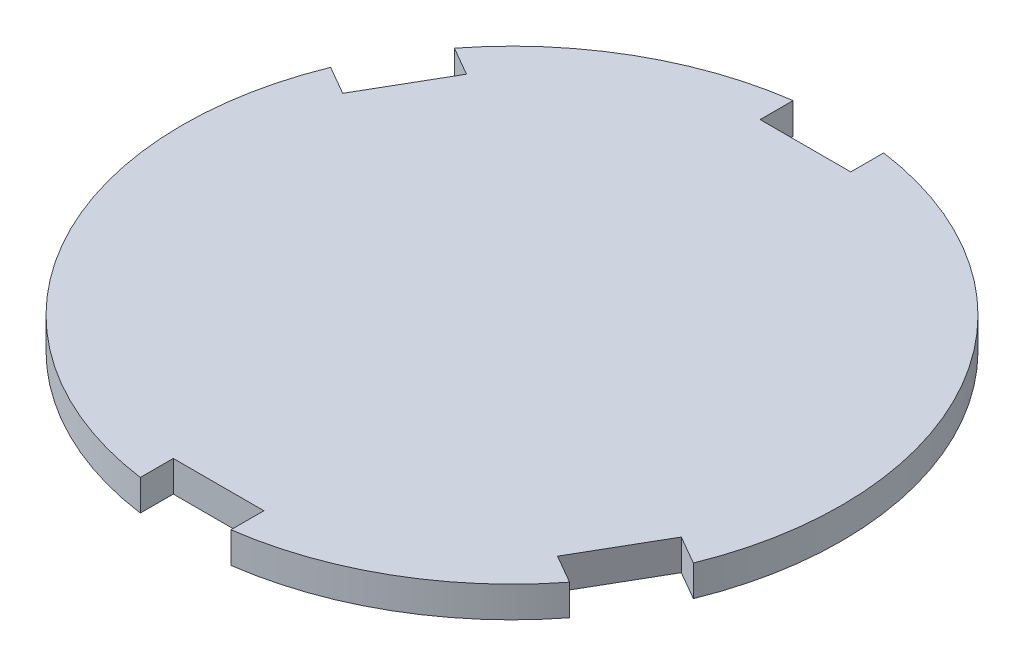
ISO-10303-21;
HEADER;
FILE_DESCRIPTION(('STEP AP214'),'2;1');
FILE_NAME('part.step','',(''),(''),'','','');
FILE_SCHEMA(('AUTOMOTIVE_DESIGN { 1 0 10303 214 1 1 1 1 }'));
ENDSEC;
DATA;
#1=APPLICATION_CONTEXT('core data for automotive mechanical design processes');
#2=APPLICATION_PROTOCOL_DEFINITION('international standard','automotive_design',2000,#1);
#3=PRODUCT_CONTEXT('',#1,'mechanical');
#4=PRODUCT('Part','Part','',(#3));
#5=PRODUCT_RELATED_PRODUCT_CATEGORY('part','',(#4));
#6=PRODUCT_DEFINITION_FORMATION('','',#4);
#7=PRODUCT_DEFINITION_CONTEXT('part definition',#1,'design');
#8=PRODUCT_DEFINITION('design','',#6,#7);
#9=PRODUCT_DEFINITION_SHAPE('','',#8);
#10=(LENGTH_UNIT() NAMED_UNIT(*) SI_UNIT(.MILLI.,.METRE.));
#11=(NAMED_UNIT(*) PLANE_ANGLE_UNIT() SI_UNIT($,.RADIAN.));
#12=(NAMED_UNIT(*) SI_UNIT($,.STERADIAN.) SOLID_ANGLE_UNIT());
#13=UNCERTAINTY_MEASURE_WITH_UNIT(LENGTH_MEASURE(1.E-05),#10,'distance_accuracy_value','');
#14=(GEOMETRIC_REPRESENTATION_CONTEXT(3) GLOBAL_UNCERTAINTY_ASSIGNED_CONTEXT((#13)) GLOBAL_UNIT_ASSIGNED_CONTEXT((#10,
#11,#12)) REPRESENTATION_CONTEXT('',''));
#15=CARTESIAN_POINT('',(0.,0.,0.));
#16=DIRECTION('',(0.,0.,1.));
#17=DIRECTION('',(1.,0.,0.));
#18=AXIS2_PLACEMENT_3D('',#15,#16,#17);
#19=CARTESIAN_POINT('',(0.,4.7625,0.));
#20=DIRECTION('',(0.,-1.,0.));
#21=DIRECTION('',(0.,0.,-1.));
#22=AXIS2_PLACEMENT_3D('',#19,#20,#21);
#23=CYLINDRICAL_SURFACE('',#22,50.8);
#24=CARTESIAN_POINT('',(0.,4.7625,0.));
#25=DIRECTION('',(0.,1.,0.));
#26=DIRECTION('',(0.,0.,1.));
#27=AXIS2_PLACEMENT_3D('',#24,#25,#26);
#28=CIRCLE('',#27,50.8);
#29=CARTESIAN_POINT('',(-47.0687243803888,4.7625,-19.109557430851));
#30=VERTEX_POINT('',#29);
#31=CARTESIAN_POINT('',(-6.98499999999999,4.7625,50.3174897525701));
#32=VERTEX_POINT('',#31);
#33=EDGE_CURVE('E43',#30,#32,#28,.T.);
#34=ORIENTED_EDGE('',*,*,#33,.F.);
#35=DIRECTION('',(0.,1.,0.));
#36=VECTOR('',#35,1.);
#37=CARTESIAN_POINT('',(-47.0687243803888,-0.00100000000000013,-19.109557430851));
#38=LINE('',#37,#36);
#39=CARTESIAN_POINT('',(-47.0687243803888,0.,-19.109557430851));
#40=VERTEX_POINT('',#39);
#41=EDGE_CURVE('E254',#40,#30,#38,.T.);
#42=ORIENTED_EDGE('',*,*,#41,.F.);
#43=CARTESIAN_POINT('',(0.,0.,0.));
#44=DIRECTION('',(0.,1.,0.));
#45=DIRECTION('',(0.,0.,1.));
#46=AXIS2_PLACEMENT_3D('',#43,#44,#45);
#47=CIRCLE('',#46,50.8);
#48=CARTESIAN_POINT('',(-6.98499999999999,0.,50.3174897525701));
#49=VERTEX_POINT('',#48);
#50=EDGE_CURVE('E173',#40,#49,#47,.T.);
#51=ORIENTED_EDGE('',*,*,#50,.T.);
#52=DIRECTION('',(0.,1.,0.));
#53=VECTOR('',#52,1.);
#54=CARTESIAN_POINT('',(-6.98499999999999,-0.00100000000000013,50.3174897525701));
#55=LINE('',#54,#53);
#56=EDGE_CURVE('E196',#49,#32,#55,.T.);
#57=ORIENTED_EDGE('',*,*,#56,.T.);
#58=EDGE_LOOP('',(#34,#42,#51,#57));
#59=FACE_BOUND('',#58,.T.);
#60=ADVANCED_FACE('F33',(#59),#23,.T.);
#61=CARTESIAN_POINT('',(6.98500000000001,0.,50.3174897525701));
#62=VERTEX_POINT('',#61);
#63=CARTESIAN_POINT('',(40.0837243803888,0.,31.2079323217196));
#64=VERTEX_POINT('',#63);
#65=EDGE_CURVE('E37',#62,#64,#47,.T.);
#66=ORIENTED_EDGE('',*,*,#65,.T.);
#67=DIRECTION('',(0.,1.,0.));
#68=VECTOR('',#67,1.);
#69=CARTESIAN_POINT('',(40.0837243803887,-0.00100000000000013,31.2079323217196));
#70=LINE('',#69,#68);
#71=CARTESIAN_POINT('',(40.0837243803887,4.7625,31.2079323217196));
#72=VERTEX_POINT('',#71);
#73=EDGE_CURVE('E150',#64,#72,#70,.T.);
#74=ORIENTED_EDGE('',*,*,#73,.T.);
#75=CARTESIAN_POINT('',(6.98500000000001,4.7625,50.3174897525701));
#76=VERTEX_POINT('',#75);
#77=EDGE_CURVE('E11',#76,#72,#28,.T.);
#78=ORIENTED_EDGE('',*,*,#77,.F.);
#79=DIRECTION('',(0.,1.,0.));
#80=VECTOR('',#79,1.);
#81=CARTESIAN_POINT('',(6.98500000000001,-0.00100000000000013,50.3174897525701));
#82=LINE('',#81,#80);
#83=EDGE_CURVE('E170',#62,#76,#82,.T.);
#84=ORIENTED_EDGE('',*,*,#83,.F.);
#85=EDGE_LOOP('',(#66,#74,#78,#84));
#86=FACE_BOUND('',#85,.T.);
#87=ADVANCED_FACE('F169',(#86),#23,.T.);
#88=CARTESIAN_POINT('',(-6.98499999999999,0.,-50.3174897525701));
#89=VERTEX_POINT('',#88);
#90=CARTESIAN_POINT('',(-40.0837243803887,0.,-31.2079323217196));
#91=VERTEX_POINT('',#90);
#92=EDGE_CURVE('E172',#89,#91,#47,.T.);
#93=ORIENTED_EDGE('',*,*,#92,.T.);
#94=DIRECTION('',(0.,1.,0.));
#95=VECTOR('',#94,1.);
#96=CARTESIAN_POINT('',(-40.0837243803887,-0.00100000000000013,-31.2079323217196));
#97=LINE('',#96,#95);
#98=CARTESIAN_POINT('',(-40.0837243803887,4.7625,-31.2079323217196));
#99=VERTEX_POINT('',#98);
#100=EDGE_CURVE('E59',#91,#99,#97,.T.);
#101=ORIENTED_EDGE('',*,*,#100,.T.);
#102=CARTESIAN_POINT('',(-6.98499999999999,4.7625,-50.3174897525701));
#103=VERTEX_POINT('',#102);
#104=EDGE_CURVE('E44',#103,#99,#28,.T.);
#105=ORIENTED_EDGE('',*,*,#104,.F.);
#106=DIRECTION('',(0.,1.,0.));
#107=VECTOR('',#106,1.);
#108=CARTESIAN_POINT('',(-6.98499999999999,-0.00100000000000013,-50.3174897525701));
#109=LINE('',#108,#107);
#110=EDGE_CURVE('E217',#89,#103,#109,.T.);
#111=ORIENTED_EDGE('',*,*,#110,.F.);
#112=EDGE_LOOP('',(#93,#101,#105,#111));
#113=FACE_BOUND('',#112,.T.);
#114=ADVANCED_FACE('F280',(#113),#23,.T.);
#115=CARTESIAN_POINT('',(47.0687243803888,4.7625,19.109557430851));
#116=VERTEX_POINT('',#115);
#117=CARTESIAN_POINT('',(6.98499999999998,4.7625,-50.3174897525701));
#118=VERTEX_POINT('',#117);
#119=EDGE_CURVE('E42',#116,#118,#28,.T.);
#120=ORIENTED_EDGE('',*,*,#119,.F.);
#121=DIRECTION('',(0.,1.,0.));
#122=VECTOR('',#121,1.);
#123=CARTESIAN_POINT('',(47.0687243803888,-0.00100000000000013,19.109557430851));
#124=LINE('',#123,#122);
#125=CARTESIAN_POINT('',(47.0687243803888,0.,19.109557430851));
#126=VERTEX_POINT('',#125);
#127=EDGE_CURVE('E159',#126,#116,#124,.T.);
#128=ORIENTED_EDGE('',*,*,#127,.F.);
#129=CARTESIAN_POINT('',(6.98499999999998,0.,-50.3174897525701));
#130=VERTEX_POINT('',#129);
#131=EDGE_CURVE('E171',#126,#130,#47,.T.);
#132=ORIENTED_EDGE('',*,*,#131,.T.);
#133=DIRECTION('',(0.,1.,0.));
#134=VECTOR('',#133,1.);
#135=CARTESIAN_POINT('',(6.98499999999998,-0.00100000000000013,-50.3174897525701));
#136=LINE('',#135,#134);
#137=EDGE_CURVE('E219',#130,#118,#136,.T.);
#138=ORIENTED_EDGE('',*,*,#137,.T.);
#139=EDGE_LOOP('',(#120,#128,#132,#138));
#140=FACE_BOUND('',#139,.T.);
#141=ADVANCED_FACE('F35',(#140),#23,.T.);
#142=CARTESIAN_POINT('',(0.,4.7625,0.));
#143=DIRECTION('',(0.,1.,0.));
#144=DIRECTION('',(0.,0.,1.));
#145=AXIS2_PLACEMENT_3D('',#142,#143,#144);
#146=PLANE('',#145);
#147=DIRECTION('',(0.866025403784436,0.,0.500000000000004));
#148=VECTOR('',#147,1.);
#149=CARTESIAN_POINT('',(35.6843153291638,4.7625,28.6679323217195));
#150=LINE('',#149,#148);
#151=CARTESIAN_POINT('',(35.6843153291638,4.7625,28.6679323217195));
#152=VERTEX_POINT('',#151);
#153=EDGE_CURVE('E155',#152,#72,#150,.T.);
#154=ORIENTED_EDGE('',*,*,#153,.F.);
#155=DIRECTION('',(-0.50000000000002,0.,0.866025403784427));
#156=VECTOR('',#155,1.);
#157=CARTESIAN_POINT('',(35.6843153291638,4.7625,28.6679323217195));
#158=LINE('',#157,#156);
#159=CARTESIAN_POINT('',(42.6693153291641,4.7625,16.5695574308511));
#160=VERTEX_POINT('',#159);
#161=EDGE_CURVE('E160',#160,#152,#158,.T.);
#162=ORIENTED_EDGE('',*,*,#161,.F.);
#163=DIRECTION('',(-0.866025403784437,0.,-0.500000000000002));
#164=VECTOR('',#163,1.);
#165=CARTESIAN_POINT('',(42.6693153291641,4.7625,16.5695574308511));
#166=LINE('',#165,#164);
#167=EDGE_CURVE('E320',#116,#160,#166,.T.);
#168=ORIENTED_EDGE('',*,*,#167,.F.);
#169=ORIENTED_EDGE('',*,*,#119,.T.);
#170=DIRECTION('',(0.,0.,-1.));
#171=VECTOR('',#170,1.);
#172=CARTESIAN_POINT('',(6.98499999999998,4.7625,-45.2374897525701));
#173=LINE('',#172,#171);
#174=CARTESIAN_POINT('',(6.98499999999998,4.7625,-45.2374897525701));
#175=VERTEX_POINT('',#174);
#176=EDGE_CURVE('E207',#175,#118,#173,.T.);
#177=ORIENTED_EDGE('',*,*,#176,.F.);
#178=DIRECTION('',(1.,0.,0.));
#179=VECTOR('',#178,1.);
#180=CARTESIAN_POINT('',(-6.98499999999999,4.7625,-45.2374897525701));
#181=LINE('',#180,#179);
#182=CARTESIAN_POINT('',(-6.98499999999999,4.7625,-45.2374897525701));
#183=VERTEX_POINT('',#182);
#184=EDGE_CURVE('E204',#183,#175,#181,.T.);
#185=ORIENTED_EDGE('',*,*,#184,.F.);
#186=DIRECTION('',(0.,0.,1.));
#187=VECTOR('',#186,1.);
#188=CARTESIAN_POINT('',(-6.98499999999999,4.7625,-45.2374897525701));
#189=LINE('',#188,#187);
#190=EDGE_CURVE('E210',#103,#183,#189,.T.);
#191=ORIENTED_EDGE('',*,*,#190,.F.);
#192=ORIENTED_EDGE('',*,*,#104,.T.);
#193=DIRECTION('',(-0.866025403784436,0.,-0.500000000000004));
#194=VECTOR('',#193,1.);
#195=CARTESIAN_POINT('',(-35.6843153291638,4.7625,-28.6679323217195));
#196=LINE('',#195,#194);
#197=CARTESIAN_POINT('',(-35.6843153291638,4.7625,-28.6679323217195));
#198=VERTEX_POINT('',#197);
#199=EDGE_CURVE('E298',#198,#99,#196,.T.);
#200=ORIENTED_EDGE('',*,*,#199,.F.);
#201=DIRECTION('',(0.500000000000004,0.,-0.866025403784436));
#202=VECTOR('',#201,1.);
#203=CARTESIAN_POINT('',(-42.6693153291639,4.7625,-16.5695574308509));
#204=LINE('',#203,#202);
#205=CARTESIAN_POINT('',(-42.6693153291639,4.7625,-16.5695574308509));
#206=VERTEX_POINT('',#205);
#207=EDGE_CURVE('E307',#206,#198,#204,.T.);
#208=ORIENTED_EDGE('',*,*,#207,.F.);
#209=DIRECTION('',(0.866025403784436,0.,0.500000000000004));
#210=VECTOR('',#209,1.);
#211=CARTESIAN_POINT('',(-42.6693153291639,4.7625,-16.5695574308509));
#212=LINE('',#211,#210);
#213=EDGE_CURVE('E302',#30,#206,#212,.T.);
#214=ORIENTED_EDGE('',*,*,#213,.F.);
#215=ORIENTED_EDGE('',*,*,#33,.T.);
#216=DIRECTION('',(0.,0.,1.));
#217=VECTOR('',#216,1.);
#218=CARTESIAN_POINT('',(-6.985,4.7625,45.2374897525701));
#219=LINE('',#218,#217);
#220=CARTESIAN_POINT('',(-6.985,4.7625,45.2374897525701));
#221=VERTEX_POINT('',#220);
#222=EDGE_CURVE('E240',#221,#32,#219,.T.);
#223=ORIENTED_EDGE('',*,*,#222,.F.);
#224=DIRECTION('',(-1.,0.,0.));
#225=VECTOR('',#224,1.);
#226=CARTESIAN_POINT('',(-6.985,4.7625,45.2374897525701));
#227=LINE('',#226,#225);
#228=CARTESIAN_POINT('',(6.98500000000001,4.7625,45.2374897525701));
#229=VERTEX_POINT('',#228);
#230=EDGE_CURVE('E192',#229,#221,#227,.T.);
#231=ORIENTED_EDGE('',*,*,#230,.F.);
#232=DIRECTION('',(0.,0.,-1.));
#233=VECTOR('',#232,1.);
#234=CARTESIAN_POINT('',(6.98500000000001,4.7625,45.2374897525701));
#235=LINE('',#234,#233);
#236=EDGE_CURVE('E241',#76,#229,#235,.T.);
#237=ORIENTED_EDGE('',*,*,#236,.F.);
#238=ORIENTED_EDGE('',*,*,#77,.T.);
#239=EDGE_LOOP('',(#154,#162,#168,#169,#177,#185,#191,#192,#200,#208,#214,#215,#223,#231,#237,#238));
#240=FACE_BOUND('',#239,.T.);
#241=ADVANCED_FACE('F249',(#240),#146,.T.);
#242=CARTESIAN_POINT('',(0.,0.,0.));
#243=DIRECTION('',(0.,1.,0.));
#244=DIRECTION('',(0.,0.,1.));
#245=AXIS2_PLACEMENT_3D('',#242,#243,#244);
#246=PLANE('',#245);
#247=DIRECTION('',(0.50000000000002,0.,-0.866025403784427));
#248=VECTOR('',#247,1.);
#249=CARTESIAN_POINT('',(35.6843153291638,0.,28.6679323217195));
#250=LINE('',#249,#248);
#251=CARTESIAN_POINT('',(35.6843153291638,0.,28.6679323217195));
#252=VERTEX_POINT('',#251);
#253=CARTESIAN_POINT('',(42.6693153291641,0.,16.5695574308511));
#254=VERTEX_POINT('',#253);
#255=EDGE_CURVE('E51',#252,#254,#250,.T.);
#256=ORIENTED_EDGE('',*,*,#255,.F.);
#257=DIRECTION('',(-0.866025403784436,0.,-0.500000000000004));
#258=VECTOR('',#257,1.);
#259=CARTESIAN_POINT('',(35.6843153291638,0.,28.6679323217195));
#260=LINE('',#259,#258);
#261=EDGE_CURVE('E153',#64,#252,#260,.T.);
#262=ORIENTED_EDGE('',*,*,#261,.F.);
#263=ORIENTED_EDGE('',*,*,#65,.F.);
#264=DIRECTION('',(0.,0.,1.));
#265=VECTOR('',#264,1.);
#266=CARTESIAN_POINT('',(6.98500000000001,0.,45.2374897525701));
#267=LINE('',#266,#265);
#268=CARTESIAN_POINT('',(6.98500000000001,0.,45.2374897525701));
#269=VERTEX_POINT('',#268);
#270=EDGE_CURVE('E224',#269,#62,#267,.T.);
#271=ORIENTED_EDGE('',*,*,#270,.F.);
#272=DIRECTION('',(1.,0.,0.));
#273=VECTOR('',#272,1.);
#274=CARTESIAN_POINT('',(-6.985,0.,45.2374897525701));
#275=LINE('',#274,#273);
#276=CARTESIAN_POINT('',(-6.985,0.,45.2374897525701));
#277=VERTEX_POINT('',#276);
#278=EDGE_CURVE('E229',#277,#269,#275,.T.);
#279=ORIENTED_EDGE('',*,*,#278,.F.);
#280=DIRECTION('',(0.,0.,-1.));
#281=VECTOR('',#280,1.);
#282=CARTESIAN_POINT('',(-6.985,0.,45.2374897525701));
#283=LINE('',#282,#281);
#284=EDGE_CURVE('E233',#49,#277,#283,.T.);
#285=ORIENTED_EDGE('',*,*,#284,.F.);
#286=ORIENTED_EDGE('',*,*,#50,.F.);
#287=DIRECTION('',(-0.866025403784436,0.,-0.500000000000004));
#288=VECTOR('',#287,1.);
#289=CARTESIAN_POINT('',(-42.6693153291639,0.,-16.5695574308509));
#290=LINE('',#289,#288);
#291=CARTESIAN_POINT('',(-42.6693153291639,0.,-16.5695574308509));
#292=VERTEX_POINT('',#291);
#293=EDGE_CURVE('E261',#292,#40,#290,.T.);
#294=ORIENTED_EDGE('',*,*,#293,.F.);
#295=DIRECTION('',(-0.500000000000004,0.,0.866025403784436));
#296=VECTOR('',#295,1.);
#297=CARTESIAN_POINT('',(-42.6693153291639,0.,-16.5695574308509));
#298=LINE('',#297,#296);
#299=CARTESIAN_POINT('',(-35.6843153291638,0.,-28.6679323217195));
#300=VERTEX_POINT('',#299);
#301=EDGE_CURVE('E311',#300,#292,#298,.T.);
#302=ORIENTED_EDGE('',*,*,#301,.F.);
#303=DIRECTION('',(0.866025403784436,0.,0.500000000000004));
#304=VECTOR('',#303,1.);
#305=CARTESIAN_POINT('',(-35.6843153291638,0.,-28.6679323217195));
#306=LINE('',#305,#304);
#307=EDGE_CURVE('E236',#91,#300,#306,.T.);
#308=ORIENTED_EDGE('',*,*,#307,.F.);
#309=ORIENTED_EDGE('',*,*,#92,.F.);
#310=DIRECTION('',(0.,0.,-1.));
#311=VECTOR('',#310,1.);
#312=CARTESIAN_POINT('',(-6.98499999999999,0.,-45.2374897525701));
#313=LINE('',#312,#311);
#314=CARTESIAN_POINT('',(-6.98499999999999,0.,-45.2374897525701));
#315=VERTEX_POINT('',#314);
#316=EDGE_CURVE('E201',#315,#89,#313,.T.);
#317=ORIENTED_EDGE('',*,*,#316,.F.);
#318=DIRECTION('',(-1.,0.,0.));
#319=VECTOR('',#318,1.);
#320=CARTESIAN_POINT('',(-6.98499999999999,0.,-45.2374897525701));
#321=LINE('',#320,#319);
#322=CARTESIAN_POINT('',(6.98499999999998,0.,-45.2374897525701));
#323=VERTEX_POINT('',#322);
#324=EDGE_CURVE('E198',#323,#315,#321,.T.);
#325=ORIENTED_EDGE('',*,*,#324,.F.);
#326=DIRECTION('',(0.,0.,1.));
#327=VECTOR('',#326,1.);
#328=CARTESIAN_POINT('',(6.98499999999998,0.,-45.2374897525701));
#329=LINE('',#328,#327);
#330=EDGE_CURVE('E216',#130,#323,#329,.T.);
#331=ORIENTED_EDGE('',*,*,#330,.F.);
#332=ORIENTED_EDGE('',*,*,#131,.F.);
#333=DIRECTION('',(0.866025403784437,0.,0.500000000000002));
#334=VECTOR('',#333,1.);
#335=CARTESIAN_POINT('',(42.6693153291641,0.,16.5695574308511));
#336=LINE('',#335,#334);
#337=EDGE_CURVE('E325',#254,#126,#336,.T.);
#338=ORIENTED_EDGE('',*,*,#337,.F.);
#339=EDGE_LOOP('',(#256,#262,#263,#271,#279,#285,#286,#294,#302,#308,#309,#317,#325,#331,#332,#338));
#340=FACE_BOUND('',#339,.T.);
#341=ADVANCED_FACE('F164',(#340),#246,.F.);
#342=CARTESIAN_POINT('',(-6.98499999999999,-0.00100000000000013,-45.2374897525701));
#343=DIRECTION('',(0.,0.,1.));
#344=DIRECTION('',(1.,0.,0.));
#345=AXIS2_PLACEMENT_3D('',#342,#343,#344);
#346=PLANE('',#345);
#347=ORIENTED_EDGE('',*,*,#324,.T.);
#348=DIRECTION('',(0.,1.,0.));
#349=VECTOR('',#348,1.);
#350=CARTESIAN_POINT('',(-6.98499999999999,-0.00100000000000013,-45.2374897525701));
#351=LINE('',#350,#349);
#352=EDGE_CURVE('E214',#315,#183,#351,.T.);
#353=ORIENTED_EDGE('',*,*,#352,.T.);
#354=ORIENTED_EDGE('',*,*,#184,.T.);
#355=DIRECTION('',(0.,1.,0.));
#356=VECTOR('',#355,1.);
#357=CARTESIAN_POINT('',(6.98499999999998,-0.00100000000000013,-45.2374897525701));
#358=LINE('',#357,#356);
#359=EDGE_CURVE('E213',#323,#175,#358,.T.);
#360=ORIENTED_EDGE('',*,*,#359,.F.);
#361=EDGE_LOOP('',(#347,#353,#354,#360));
#362=FACE_BOUND('',#361,.T.);
#363=ADVANCED_FACE('F415',(#362),#346,.F.);
#364=CARTESIAN_POINT('',(-6.98499999999999,-0.00100000000000013,-45.2374897525701));
#365=DIRECTION('',(-1.,0.,0.));
#366=DIRECTION('',(0.,0.,1.));
#367=AXIS2_PLACEMENT_3D('',#364,#365,#366);
#368=PLANE('',#367);
#369=ORIENTED_EDGE('',*,*,#316,.T.);
#370=ORIENTED_EDGE('',*,*,#110,.T.);
#371=ORIENTED_EDGE('',*,*,#190,.T.);
#372=ORIENTED_EDGE('',*,*,#352,.F.);
#373=EDGE_LOOP('',(#369,#370,#371,#372));
#374=FACE_BOUND('',#373,.T.);
#375=ADVANCED_FACE('F407',(#374),#368,.F.);
#376=CARTESIAN_POINT('',(6.98499999999998,-0.00100000000000013,-45.2374897525701));
#377=DIRECTION('',(1.,0.,0.));
#378=DIRECTION('',(0.,0.,-1.));
#379=AXIS2_PLACEMENT_3D('',#376,#377,#378);
#380=PLANE('',#379);
#381=ORIENTED_EDGE('',*,*,#330,.T.);
#382=ORIENTED_EDGE('',*,*,#359,.T.);
#383=ORIENTED_EDGE('',*,*,#176,.T.);
#384=ORIENTED_EDGE('',*,*,#137,.F.);
#385=EDGE_LOOP('',(#381,#382,#383,#384));
#386=FACE_BOUND('',#385,.T.);
#387=ADVANCED_FACE('F400',(#386),#380,.F.);
#388=CARTESIAN_POINT('',(-6.985,-0.00100000000000013,45.2374897525701));
#389=DIRECTION('',(-1.,0.,0.));
#390=DIRECTION('',(0.,0.,1.));
#391=AXIS2_PLACEMENT_3D('',#388,#389,#390);
#392=PLANE('',#391);
#393=ORIENTED_EDGE('',*,*,#284,.T.);
#394=DIRECTION('',(0.,1.,0.));
#395=VECTOR('',#394,1.);
#396=CARTESIAN_POINT('',(-6.985,-0.00100000000000013,45.2374897525701));
#397=LINE('',#396,#395);
#398=EDGE_CURVE('E178',#277,#221,#397,.T.);
#399=ORIENTED_EDGE('',*,*,#398,.T.);
#400=ORIENTED_EDGE('',*,*,#222,.T.);
#401=ORIENTED_EDGE('',*,*,#56,.F.);
#402=EDGE_LOOP('',(#393,#399,#400,#401));
#403=FACE_BOUND('',#402,.T.);
#404=ADVANCED_FACE('F252',(#403),#392,.F.);
#405=CARTESIAN_POINT('',(-6.985,-0.00100000000000013,45.2374897525701));
#406=DIRECTION('',(0.,0.,-1.));
#407=DIRECTION('',(-1.,0.,0.));
#408=AXIS2_PLACEMENT_3D('',#405,#406,#407);
#409=PLANE('',#408);
#410=ORIENTED_EDGE('',*,*,#278,.T.);
#411=DIRECTION('',(0.,1.,0.));
#412=VECTOR('',#411,1.);
#413=CARTESIAN_POINT('',(6.98500000000001,-0.00100000000000013,45.2374897525701));
#414=LINE('',#413,#412);
#415=EDGE_CURVE('E184',#269,#229,#414,.T.);
#416=ORIENTED_EDGE('',*,*,#415,.T.);
#417=ORIENTED_EDGE('',*,*,#230,.T.);
#418=ORIENTED_EDGE('',*,*,#398,.F.);
#419=EDGE_LOOP('',(#410,#416,#417,#418));
#420=FACE_BOUND('',#419,.T.);
#421=ADVANCED_FACE('F247',(#420),#409,.F.);
#422=CARTESIAN_POINT('',(6.98500000000001,-0.00100000000000013,45.2374897525701));
#423=DIRECTION('',(1.,0.,0.));
#424=DIRECTION('',(0.,0.,-1.));
#425=AXIS2_PLACEMENT_3D('',#422,#423,#424);
#426=PLANE('',#425);
#427=ORIENTED_EDGE('',*,*,#270,.T.);
#428=ORIENTED_EDGE('',*,*,#83,.T.);
#429=ORIENTED_EDGE('',*,*,#236,.T.);
#430=ORIENTED_EDGE('',*,*,#415,.F.);
#431=EDGE_LOOP('',(#427,#428,#429,#430));
#432=FACE_BOUND('',#431,.T.);
#433=ADVANCED_FACE('F263',(#432),#426,.F.);
#434=CARTESIAN_POINT('',(-42.6693153291639,-0.00100000000000013,-16.5695574308509));
#435=DIRECTION('',(0.866025403784436,0.,0.500000000000004));
#436=DIRECTION('',(0.500000000000004,0.,-0.866025403784436));
#437=AXIS2_PLACEMENT_3D('',#434,#435,#436);
#438=PLANE('',#437);
#439=ORIENTED_EDGE('',*,*,#301,.T.);
#440=DIRECTION('',(0.,1.,0.));
#441=VECTOR('',#440,1.);
#442=CARTESIAN_POINT('',(-42.6693153291639,-0.00100000000000013,-16.5695574308509));
#443=LINE('',#442,#441);
#444=EDGE_CURVE('E257',#292,#206,#443,.T.);
#445=ORIENTED_EDGE('',*,*,#444,.T.);
#446=ORIENTED_EDGE('',*,*,#207,.T.);
#447=DIRECTION('',(0.,1.,0.));
#448=VECTOR('',#447,1.);
#449=CARTESIAN_POINT('',(-35.6843153291638,-0.00100000000000013,-28.6679323217195));
#450=LINE('',#449,#448);
#451=EDGE_CURVE('E300',#300,#198,#450,.T.);
#452=ORIENTED_EDGE('',*,*,#451,.F.);
#453=EDGE_LOOP('',(#439,#445,#446,#452));
#454=FACE_BOUND('',#453,.T.);
#455=ADVANCED_FACE('F265',(#454),#438,.F.);
#456=CARTESIAN_POINT('',(-42.6693153291639,-0.00100000000000013,-16.5695574308509));
#457=DIRECTION('',(-0.500000000000004,0.,0.866025403784436));
#458=DIRECTION('',(0.866025403784436,0.,0.500000000000004));
#459=AXIS2_PLACEMENT_3D('',#456,#457,#458);
#460=PLANE('',#459);
#461=ORIENTED_EDGE('',*,*,#293,.T.);
#462=ORIENTED_EDGE('',*,*,#41,.T.);
#463=ORIENTED_EDGE('',*,*,#213,.T.);
#464=ORIENTED_EDGE('',*,*,#444,.F.);
#465=EDGE_LOOP('',(#461,#462,#463,#464));
#466=FACE_BOUND('',#465,.T.);
#467=ADVANCED_FACE('F271',(#466),#460,.F.);
#468=CARTESIAN_POINT('',(-35.6843153291638,-0.00100000000000013,-28.6679323217195));
#469=DIRECTION('',(0.500000000000004,0.,-0.866025403784436));
#470=DIRECTION('',(-0.866025403784436,0.,-0.500000000000004));
#471=AXIS2_PLACEMENT_3D('',#468,#469,#470);
#472=PLANE('',#471);
#473=ORIENTED_EDGE('',*,*,#307,.T.);
#474=ORIENTED_EDGE('',*,*,#451,.T.);
#475=ORIENTED_EDGE('',*,*,#199,.T.);
#476=ORIENTED_EDGE('',*,*,#100,.F.);
#477=EDGE_LOOP('',(#473,#474,#475,#476));
#478=FACE_BOUND('',#477,.T.);
#479=ADVANCED_FACE('F327',(#478),#472,.F.);
#480=CARTESIAN_POINT('',(35.6843153291638,-0.00100000000000013,28.6679323217195));
#481=DIRECTION('',(-0.500000000000004,0.,0.866025403784436));
#482=DIRECTION('',(0.866025403784436,0.,0.500000000000004));
#483=AXIS2_PLACEMENT_3D('',#480,#481,#482);
#484=PLANE('',#483);
#485=ORIENTED_EDGE('',*,*,#261,.T.);
#486=DIRECTION('',(0.,1.,0.));
#487=VECTOR('',#486,1.);
#488=CARTESIAN_POINT('',(35.6843153291638,-0.00100000000000013,28.6679323217195));
#489=LINE('',#488,#487);
#490=EDGE_CURVE('E202',#252,#152,#489,.T.);
#491=ORIENTED_EDGE('',*,*,#490,.T.);
#492=ORIENTED_EDGE('',*,*,#153,.T.);
#493=ORIENTED_EDGE('',*,*,#73,.F.);
#494=EDGE_LOOP('',(#485,#491,#492,#493));
#495=FACE_BOUND('',#494,.T.);
#496=ADVANCED_FACE('F152',(#495),#484,.F.);
#497=CARTESIAN_POINT('',(35.6843153291638,-0.00100000000000013,28.6679323217195));
#498=DIRECTION('',(-0.866025403784427,0.,-0.50000000000002));
#499=DIRECTION('',(-0.50000000000002,0.,0.866025403784427));
#500=AXIS2_PLACEMENT_3D('',#497,#498,#499);
#501=PLANE('',#500);
#502=ORIENTED_EDGE('',*,*,#255,.T.);
#503=DIRECTION('',(0.,1.,0.));
#504=VECTOR('',#503,1.);
#505=CARTESIAN_POINT('',(42.6693153291641,-0.00100000000000013,16.5695574308511));
#506=LINE('',#505,#504);
#507=EDGE_CURVE('E315',#254,#160,#506,.T.);
#508=ORIENTED_EDGE('',*,*,#507,.T.);
#509=ORIENTED_EDGE('',*,*,#161,.T.);
#510=ORIENTED_EDGE('',*,*,#490,.F.);
#511=EDGE_LOOP('',(#502,#508,#509,#510));
#512=FACE_BOUND('',#511,.T.);
#513=ADVANCED_FACE('F337',(#512),#501,.F.);
#514=CARTESIAN_POINT('',(42.6693153291641,-0.00100000000000013,16.5695574308511));
#515=DIRECTION('',(0.500000000000002,0.,-0.866025403784437));
#516=DIRECTION('',(-0.866025403784437,0.,-0.500000000000002));
#517=AXIS2_PLACEMENT_3D('',#514,#515,#516);
#518=PLANE('',#517);
#519=ORIENTED_EDGE('',*,*,#337,.T.);
#520=ORIENTED_EDGE('',*,*,#127,.T.);
#521=ORIENTED_EDGE('',*,*,#167,.T.);
#522=ORIENTED_EDGE('',*,*,#507,.F.);
#523=EDGE_LOOP('',(#519,#520,#521,#522));
#524=FACE_BOUND('',#523,.T.);
#525=ADVANCED_FACE('F338',(#524),#518,.F.);
#526=CLOSED_SHELL('',(#60,#87,#114,#141,#241,#341,#363,#375,#387,#404,#421,#433,#455,#467,#479,
#496,#513,#525));
#527=MANIFOLD_SOLID_BREP('B2',#526);
#528=ADVANCED_BREP_SHAPE_REPRESENTATION('',(#18,#527),#14);
#529=SHAPE_DEFINITION_REPRESENTATION(#9,#528);
ENDSEC;
END-ISO-10303-21;
